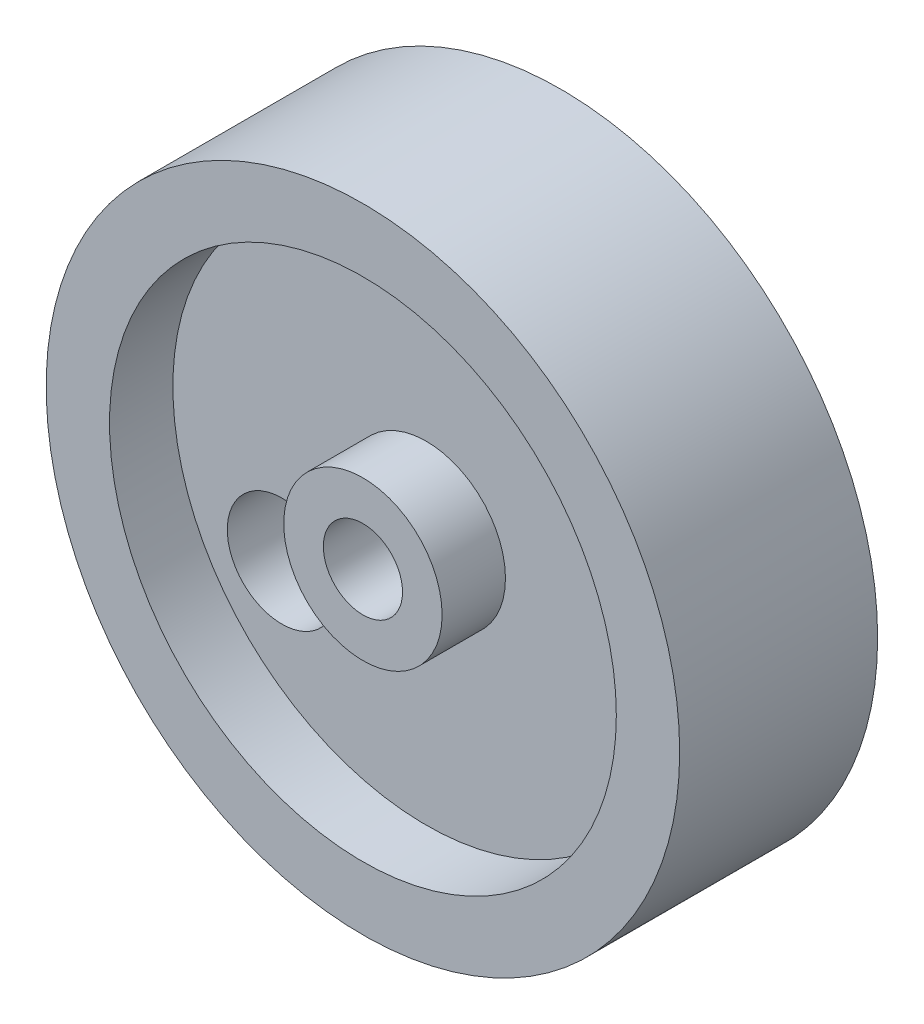
ISO-10303-21;
HEADER;
FILE_DESCRIPTION(('STEP AP214'),'2;1');
FILE_NAME('part.step','',(''),(''),'','','');
FILE_SCHEMA(('AUTOMOTIVE_DESIGN { 1 0 10303 214 1 1 1 1 }'));
ENDSEC;
DATA;
#1=APPLICATION_CONTEXT('core data for automotive mechanical design processes');
#2=APPLICATION_PROTOCOL_DEFINITION('international standard','automotive_design',2000,#1);
#3=PRODUCT_CONTEXT('',#1,'mechanical');
#4=PRODUCT('Part','Part','',(#3));
#5=PRODUCT_RELATED_PRODUCT_CATEGORY('part','',(#4));
#6=PRODUCT_DEFINITION_FORMATION('','',#4);
#7=PRODUCT_DEFINITION_CONTEXT('part definition',#1,'design');
#8=PRODUCT_DEFINITION('design','',#6,#7);
#9=PRODUCT_DEFINITION_SHAPE('','',#8);
#10=(LENGTH_UNIT() NAMED_UNIT(*) SI_UNIT(.MILLI.,.METRE.));
#11=(NAMED_UNIT(*) PLANE_ANGLE_UNIT() SI_UNIT($,.RADIAN.));
#12=(NAMED_UNIT(*) SI_UNIT($,.STERADIAN.) SOLID_ANGLE_UNIT());
#13=UNCERTAINTY_MEASURE_WITH_UNIT(LENGTH_MEASURE(1.E-05),#10,'distance_accuracy_value','');
#14=(GEOMETRIC_REPRESENTATION_CONTEXT(3) GLOBAL_UNCERTAINTY_ASSIGNED_CONTEXT((#13)) GLOBAL_UNIT_ASSIGNED_CONTEXT((#10,
#11,#12)) REPRESENTATION_CONTEXT('',''));
#15=CARTESIAN_POINT('',(0.,0.,0.));
#16=DIRECTION('',(0.,0.,1.));
#17=DIRECTION('',(1.,0.,0.));
#18=AXIS2_PLACEMENT_3D('',#15,#16,#17);
#19=CARTESIAN_POINT('',(0.,0.,-15.875));
#20=DIRECTION('',(0.,0.,1.));
#21=DIRECTION('',(1.,0.,0.));
#22=AXIS2_PLACEMENT_3D('',#19,#20,#21);
#23=PLANE('',#22);
#24=CARTESIAN_POINT('',(0.,0.,-15.875));
#25=DIRECTION('',(0.,0.,1.));
#26=DIRECTION('',(1.,0.,0.));
#27=AXIS2_PLACEMENT_3D('',#24,#25,#26);
#28=CIRCLE('',#27,6.35);
#29=CARTESIAN_POINT('',(6.35,0.,-15.875));
#30=VERTEX_POINT('',#29);
#31=EDGE_CURVE('E61',#30,#30,#28,.T.);
#32=ORIENTED_EDGE('',*,*,#31,.T.);
#33=EDGE_LOOP('',(#32));
#34=FACE_BOUND('',#33,.T.);
#35=CARTESIAN_POINT('',(0.,0.,-15.875));
#36=DIRECTION('',(0.,0.,1.));
#37=DIRECTION('',(1.,0.,0.));
#38=AXIS2_PLACEMENT_3D('',#35,#36,#37);
#39=CIRCLE('',#38,12.7);
#40=CARTESIAN_POINT('',(12.7,0.,-15.875));
#41=VERTEX_POINT('',#40);
#42=EDGE_CURVE('E95',#41,#41,#39,.T.);
#43=ORIENTED_EDGE('',*,*,#42,.F.);
#44=EDGE_LOOP('',(#43));
#45=FACE_BOUND('',#44,.T.);
#46=ADVANCED_FACE('F48',(#34,#45),#23,.F.);
#47=CARTESIAN_POINT('',(0.,0.,15.875));
#48=DIRECTION('',(0.,0.,1.));
#49=DIRECTION('',(1.,0.,0.));
#50=AXIS2_PLACEMENT_3D('',#47,#48,#49);
#51=PLANE('',#50);
#52=CARTESIAN_POINT('',(0.,0.,15.875));
#53=DIRECTION('',(0.,0.,1.));
#54=DIRECTION('',(1.,0.,0.));
#55=AXIS2_PLACEMENT_3D('',#52,#53,#54);
#56=CIRCLE('',#55,6.35);
#57=CARTESIAN_POINT('',(6.35,0.,15.875));
#58=VERTEX_POINT('',#57);
#59=EDGE_CURVE('E63',#58,#58,#56,.T.);
#60=ORIENTED_EDGE('',*,*,#59,.F.);
#61=EDGE_LOOP('',(#60));
#62=FACE_BOUND('',#61,.T.);
#63=CARTESIAN_POINT('',(0.,0.,15.875));
#64=DIRECTION('',(0.,0.,1.));
#65=DIRECTION('',(1.,0.,0.));
#66=AXIS2_PLACEMENT_3D('',#63,#64,#65);
#67=CIRCLE('',#66,12.7);
#68=CARTESIAN_POINT('',(12.7,0.,15.875));
#69=VERTEX_POINT('',#68);
#70=EDGE_CURVE('E79',#69,#69,#67,.T.);
#71=ORIENTED_EDGE('',*,*,#70,.T.);
#72=EDGE_LOOP('',(#71));
#73=FACE_BOUND('',#72,.T.);
#74=ADVANCED_FACE('F133',(#62,#73),#51,.T.);
#75=CARTESIAN_POINT('',(0.,0.,-15.875));
#76=DIRECTION('',(0.,0.,1.));
#77=DIRECTION('',(1.,0.,0.));
#78=AXIS2_PLACEMENT_3D('',#75,#76,#77);
#79=CYLINDRICAL_SURFACE('',#78,50.8);
#80=CARTESIAN_POINT('',(0.,0.,-15.875));
#81=DIRECTION('',(0.,0.,1.));
#82=DIRECTION('',(1.,0.,0.));
#83=AXIS2_PLACEMENT_3D('',#80,#81,#82);
#84=CIRCLE('',#83,50.8);
#85=CARTESIAN_POINT('',(50.8,0.,-15.875));
#86=VERTEX_POINT('',#85);
#87=EDGE_CURVE('E12',#86,#86,#84,.T.);
#88=ORIENTED_EDGE('',*,*,#87,.T.);
#89=EDGE_LOOP('',(#88));
#90=FACE_BOUND('',#89,.T.);
#91=CARTESIAN_POINT('',(0.,0.,15.875));
#92=DIRECTION('',(0.,0.,1.));
#93=DIRECTION('',(1.,0.,0.));
#94=AXIS2_PLACEMENT_3D('',#91,#92,#93);
#95=CIRCLE('',#94,50.8);
#96=CARTESIAN_POINT('',(50.8,0.,15.875));
#97=VERTEX_POINT('',#96);
#98=EDGE_CURVE('E52',#97,#97,#95,.T.);
#99=ORIENTED_EDGE('',*,*,#98,.F.);
#100=EDGE_LOOP('',(#99));
#101=FACE_BOUND('',#100,.T.);
#102=ADVANCED_FACE('F50',(#90,#101),#79,.T.);
#103=CARTESIAN_POINT('',(0.,0.,-15.875));
#104=DIRECTION('',(0.,0.,1.));
#105=DIRECTION('',(1.,0.,0.));
#106=AXIS2_PLACEMENT_3D('',#103,#104,#105);
#107=CIRCLE('',#106,40.64);
#108=CARTESIAN_POINT('',(40.64,0.,-15.875));
#109=VERTEX_POINT('',#108);
#110=EDGE_CURVE('E87',#109,#109,#107,.T.);
#111=ORIENTED_EDGE('',*,*,#110,.T.);
#112=EDGE_LOOP('',(#111));
#113=FACE_BOUND('',#112,.T.);
#114=ORIENTED_EDGE('',*,*,#87,.F.);
#115=EDGE_LOOP('',(#114));
#116=FACE_BOUND('',#115,.T.);
#117=ADVANCED_FACE('F132',(#113,#116),#23,.F.);
#118=CARTESIAN_POINT('',(0.,0.,15.875));
#119=DIRECTION('',(0.,0.,1.));
#120=DIRECTION('',(1.,0.,0.));
#121=AXIS2_PLACEMENT_3D('',#118,#119,#120);
#122=CIRCLE('',#121,40.64);
#123=CARTESIAN_POINT('',(40.64,0.,15.875));
#124=VERTEX_POINT('',#123);
#125=EDGE_CURVE('E71',#124,#124,#122,.T.);
#126=ORIENTED_EDGE('',*,*,#125,.F.);
#127=EDGE_LOOP('',(#126));
#128=FACE_BOUND('',#127,.T.);
#129=ORIENTED_EDGE('',*,*,#98,.T.);
#130=EDGE_LOOP('',(#129));
#131=FACE_BOUND('',#130,.T.);
#132=ADVANCED_FACE('F129',(#128,#131),#51,.T.);
#133=CARTESIAN_POINT('',(0.,0.,-15.875));
#134=DIRECTION('',(0.,0.,1.));
#135=DIRECTION('',(1.,0.,0.));
#136=AXIS2_PLACEMENT_3D('',#133,#134,#135);
#137=CYLINDRICAL_SURFACE('',#136,6.35);
#138=ORIENTED_EDGE('',*,*,#31,.F.);
#139=EDGE_LOOP('',(#138));
#140=FACE_BOUND('',#139,.T.);
#141=ORIENTED_EDGE('',*,*,#59,.T.);
#142=EDGE_LOOP('',(#141));
#143=FACE_BOUND('',#142,.T.);
#144=ADVANCED_FACE('F125',(#140,#143),#137,.F.);
#145=CARTESIAN_POINT('',(0.,0.,5.715));
#146=DIRECTION('',(0.,0.,1.));
#147=DIRECTION('',(1.,0.,0.));
#148=AXIS2_PLACEMENT_3D('',#145,#146,#147);
#149=CYLINDRICAL_SURFACE('',#148,40.64);
#150=CARTESIAN_POINT('',(0.,0.,5.715));
#151=DIRECTION('',(0.,0.,1.));
#152=DIRECTION('',(1.,0.,0.));
#153=AXIS2_PLACEMENT_3D('',#150,#151,#152);
#154=CIRCLE('',#153,40.64);
#155=CARTESIAN_POINT('',(40.64,0.,5.715));
#156=VERTEX_POINT('',#155);
#157=EDGE_CURVE('E67',#156,#156,#154,.T.);
#158=ORIENTED_EDGE('',*,*,#157,.F.);
#159=EDGE_LOOP('',(#158));
#160=FACE_BOUND('',#159,.T.);
#161=ORIENTED_EDGE('',*,*,#125,.T.);
#162=EDGE_LOOP('',(#161));
#163=FACE_BOUND('',#162,.T.);
#164=ADVANCED_FACE('F117',(#160,#163),#149,.F.);
#165=CARTESIAN_POINT('',(0.,0.,5.715));
#166=DIRECTION('',(0.,0.,1.));
#167=DIRECTION('',(1.,0.,0.));
#168=AXIS2_PLACEMENT_3D('',#165,#166,#167);
#169=PLANE('',#168);
#170=CARTESIAN_POINT('',(-23.151287749041,-15.5272568661466,5.715));
#171=DIRECTION('',(0.,0.,1.));
#172=DIRECTION('',(1.,0.,0.));
#173=AXIS2_PLACEMENT_3D('',#170,#171,#172);
#174=CIRCLE('',#173,8.75892899756953);
#175=CARTESIAN_POINT('',(-14.3923587514714,-15.5272568661466,5.715));
#176=VERTEX_POINT('',#175);
#177=EDGE_CURVE('E99',#176,#176,#174,.T.);
#178=ORIENTED_EDGE('',*,*,#177,.F.);
#179=EDGE_LOOP('',(#178));
#180=FACE_BOUND('',#179,.T.);
#181=CARTESIAN_POINT('',(0.,0.,5.715));
#182=DIRECTION('',(0.,0.,1.));
#183=DIRECTION('',(1.,0.,0.));
#184=AXIS2_PLACEMENT_3D('',#181,#182,#183);
#185=CIRCLE('',#184,12.7);
#186=CARTESIAN_POINT('',(12.7,0.,5.715));
#187=VERTEX_POINT('',#186);
#188=EDGE_CURVE('E75',#187,#187,#185,.T.);
#189=ORIENTED_EDGE('',*,*,#188,.F.);
#190=EDGE_LOOP('',(#189));
#191=FACE_BOUND('',#190,.T.);
#192=ORIENTED_EDGE('',*,*,#157,.T.);
#193=EDGE_LOOP('',(#192));
#194=FACE_BOUND('',#193,.T.);
#195=ADVANCED_FACE('F113',(#180,#191,#194),#169,.T.);
#196=CARTESIAN_POINT('',(0.,0.,5.715));
#197=DIRECTION('',(0.,0.,1.));
#198=DIRECTION('',(1.,0.,0.));
#199=AXIS2_PLACEMENT_3D('',#196,#197,#198);
#200=CYLINDRICAL_SURFACE('',#199,12.7);
#201=ORIENTED_EDGE('',*,*,#188,.T.);
#202=EDGE_LOOP('',(#201));
#203=FACE_BOUND('',#202,.T.);
#204=ORIENTED_EDGE('',*,*,#70,.F.);
#205=EDGE_LOOP('',(#204));
#206=FACE_BOUND('',#205,.T.);
#207=ADVANCED_FACE('F116',(#203,#206),#200,.T.);
#208=CARTESIAN_POINT('',(0.,0.,-5.715));
#209=DIRECTION('',(0.,0.,-1.));
#210=DIRECTION('',(1.,0.,0.));
#211=AXIS2_PLACEMENT_3D('',#208,#209,#210);
#212=PLANE('',#211);
#213=CARTESIAN_POINT('',(-23.151287749041,-15.5272568661466,-5.715));
#214=DIRECTION('',(0.,0.,-1.));
#215=DIRECTION('',(-1.,0.,0.));
#216=AXIS2_PLACEMENT_3D('',#213,#214,#215);
#217=CIRCLE('',#216,8.75892899756953);
#218=CARTESIAN_POINT('',(-31.9102167466105,-15.5272568661466,-5.715));
#219=VERTEX_POINT('',#218);
#220=EDGE_CURVE('E103',#219,#219,#217,.F.);
#221=ORIENTED_EDGE('',*,*,#220,.T.);
#222=EDGE_LOOP('',(#221));
#223=FACE_BOUND('',#222,.T.);
#224=CARTESIAN_POINT('',(0.,0.,-5.715));
#225=DIRECTION('',(0.,0.,1.));
#226=DIRECTION('',(1.,0.,0.));
#227=AXIS2_PLACEMENT_3D('',#224,#225,#226);
#228=CIRCLE('',#227,40.64);
#229=CARTESIAN_POINT('',(40.64,0.,-5.715));
#230=VERTEX_POINT('',#229);
#231=EDGE_CURVE('E83',#230,#230,#228,.T.);
#232=ORIENTED_EDGE('',*,*,#231,.F.);
#233=EDGE_LOOP('',(#232));
#234=FACE_BOUND('',#233,.T.);
#235=CARTESIAN_POINT('',(0.,0.,-5.715));
#236=DIRECTION('',(0.,0.,1.));
#237=DIRECTION('',(1.,0.,0.));
#238=AXIS2_PLACEMENT_3D('',#235,#236,#237);
#239=CIRCLE('',#238,12.7);
#240=CARTESIAN_POINT('',(12.7,0.,-5.715));
#241=VERTEX_POINT('',#240);
#242=EDGE_CURVE('E91',#241,#241,#239,.T.);
#243=ORIENTED_EDGE('',*,*,#242,.T.);
#244=EDGE_LOOP('',(#243));
#245=FACE_BOUND('',#244,.T.);
#246=ADVANCED_FACE('F155',(#223,#234,#245),#212,.T.);
#247=CARTESIAN_POINT('',(0.,0.,-5.715));
#248=DIRECTION('',(0.,0.,-1.));
#249=DIRECTION('',(-1.,0.,0.));
#250=AXIS2_PLACEMENT_3D('',#247,#248,#249);
#251=CYLINDRICAL_SURFACE('',#250,40.64);
#252=ORIENTED_EDGE('',*,*,#231,.T.);
#253=EDGE_LOOP('',(#252));
#254=FACE_BOUND('',#253,.T.);
#255=ORIENTED_EDGE('',*,*,#110,.F.);
#256=EDGE_LOOP('',(#255));
#257=FACE_BOUND('',#256,.T.);
#258=ADVANCED_FACE('F157',(#254,#257),#251,.F.);
#259=CARTESIAN_POINT('',(0.,0.,-5.715));
#260=DIRECTION('',(0.,0.,-1.));
#261=DIRECTION('',(-1.,0.,0.));
#262=AXIS2_PLACEMENT_3D('',#259,#260,#261);
#263=CYLINDRICAL_SURFACE('',#262,12.7);
#264=ORIENTED_EDGE('',*,*,#242,.F.);
#265=EDGE_LOOP('',(#264));
#266=FACE_BOUND('',#265,.T.);
#267=ORIENTED_EDGE('',*,*,#42,.T.);
#268=EDGE_LOOP('',(#267));
#269=FACE_BOUND('',#268,.T.);
#270=ADVANCED_FACE('F160',(#266,#269),#263,.T.);
#271=CARTESIAN_POINT('',(-23.151287749041,-15.5272568661466,-15.876));
#272=DIRECTION('',(0.,0.,1.));
#273=DIRECTION('',(1.,0.,0.));
#274=AXIS2_PLACEMENT_3D('',#271,#272,#273);
#275=CYLINDRICAL_SURFACE('',#274,8.75892899756953);
#276=ORIENTED_EDGE('',*,*,#220,.F.);
#277=EDGE_LOOP('',(#276));
#278=FACE_BOUND('',#277,.T.);
#279=ORIENTED_EDGE('',*,*,#177,.T.);
#280=EDGE_LOOP('',(#279));
#281=FACE_BOUND('',#280,.T.);
#282=ADVANCED_FACE('F111',(#278,#281),#275,.F.);
#283=CLOSED_SHELL('',(#46,#74,#102,#117,#132,#144,#164,#195,#207,#246,#258,#270,#282));
#284=MANIFOLD_SOLID_BREP('B2',#283);
#285=ADVANCED_BREP_SHAPE_REPRESENTATION('',(#18,#284),#14);
#286=SHAPE_DEFINITION_REPRESENTATION(#9,#285);
ENDSEC;
END-ISO-10303-21;
